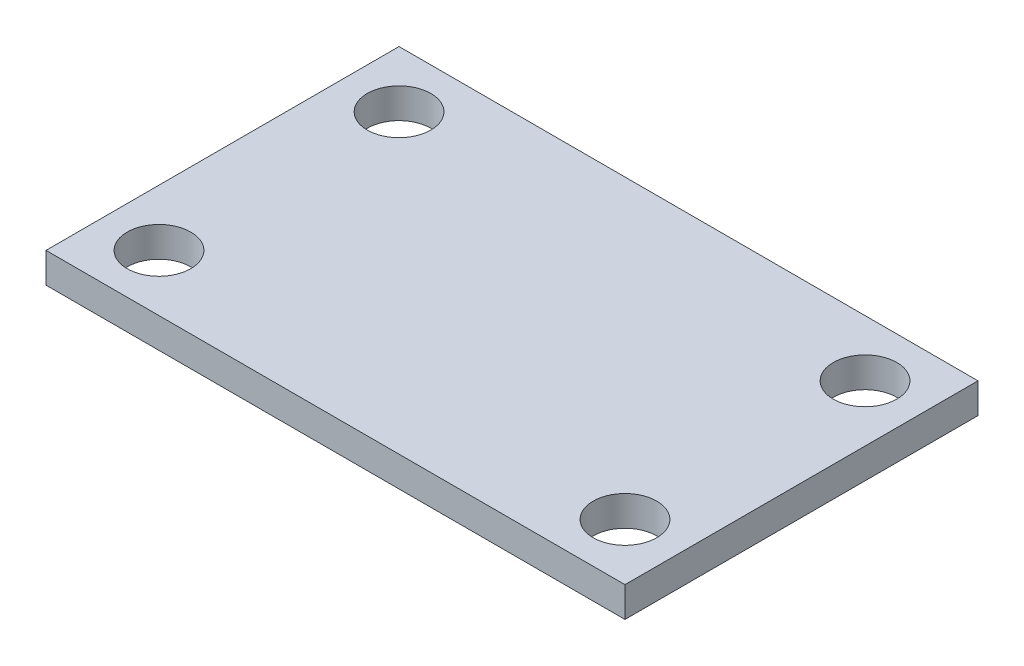
ISO-10303-21;
HEADER;
FILE_DESCRIPTION(('STEP AP214'),'2;1');
FILE_NAME('part.step','',(''),(''),'','','');
FILE_SCHEMA(('AUTOMOTIVE_DESIGN { 1 0 10303 214 1 1 1 1 }'));
ENDSEC;
DATA;
#1=APPLICATION_CONTEXT('core data for automotive mechanical design processes');
#2=APPLICATION_PROTOCOL_DEFINITION('international standard','automotive_design',2000,#1);
#3=PRODUCT_CONTEXT('',#1,'mechanical');
#4=PRODUCT('Part','Part','',(#3));
#5=PRODUCT_RELATED_PRODUCT_CATEGORY('part','',(#4));
#6=PRODUCT_DEFINITION_FORMATION('','',#4);
#7=PRODUCT_DEFINITION_CONTEXT('part definition',#1,'design');
#8=PRODUCT_DEFINITION('design','',#6,#7);
#9=PRODUCT_DEFINITION_SHAPE('','',#8);
#10=(LENGTH_UNIT() NAMED_UNIT(*) SI_UNIT(.MILLI.,.METRE.));
#11=(NAMED_UNIT(*) PLANE_ANGLE_UNIT() SI_UNIT($,.RADIAN.));
#12=(NAMED_UNIT(*) SI_UNIT($,.STERADIAN.) SOLID_ANGLE_UNIT());
#13=UNCERTAINTY_MEASURE_WITH_UNIT(LENGTH_MEASURE(1.E-05),#10,'distance_accuracy_value','');
#14=(GEOMETRIC_REPRESENTATION_CONTEXT(3) GLOBAL_UNCERTAINTY_ASSIGNED_CONTEXT((#13)) GLOBAL_UNIT_ASSIGNED_CONTEXT((#10,
#11,#12)) REPRESENTATION_CONTEXT('',''));
#15=CARTESIAN_POINT('',(0.,0.,0.));
#16=DIRECTION('',(0.,0.,1.));
#17=DIRECTION('',(1.,0.,0.));
#18=AXIS2_PLACEMENT_3D('',#15,#16,#17);
#19=CARTESIAN_POINT('',(-62.6618476114881,-321.310072168843,-531.1739));
#20=DIRECTION('',(0.,1.,0.));
#21=DIRECTION('',(0.,0.,1.));
#22=AXIS2_PLACEMENT_3D('',#19,#20,#21);
#23=PLANE('',#22);
#24=CARTESIAN_POINT('',(-95.6618476114881,-321.310072168843,-548.1739));
#25=DIRECTION('',(0.,-1.,0.));
#26=DIRECTION('',(0.,0.,-1.));
#27=AXIS2_PLACEMENT_3D('',#24,#25,#26);
#28=CIRCLE('',#27,4.5);
#29=CARTESIAN_POINT('',(-95.6618476114881,-321.310072168843,-552.6739));
#30=VERTEX_POINT('',#29);
#31=EDGE_CURVE('E102',#30,#30,#28,.F.);
#32=ORIENTED_EDGE('',*,*,#31,.T.);
#33=EDGE_LOOP('',(#32));
#34=FACE_BOUND('',#33,.T.);
#35=CARTESIAN_POINT('',(-29.6618476114881,-321.310072168843,-548.1739));
#36=DIRECTION('',(0.,-1.,0.));
#37=DIRECTION('',(0.,0.,-1.));
#38=AXIS2_PLACEMENT_3D('',#35,#36,#37);
#39=CIRCLE('',#38,4.5);
#40=CARTESIAN_POINT('',(-29.6618476114881,-321.310072168843,-552.6739));
#41=VERTEX_POINT('',#40);
#42=EDGE_CURVE('E106',#41,#41,#39,.F.);
#43=ORIENTED_EDGE('',*,*,#42,.T.);
#44=EDGE_LOOP('',(#43));
#45=FACE_BOUND('',#44,.T.);
#46=CARTESIAN_POINT('',(-29.6618476114882,-321.310072168843,-514.1739));
#47=DIRECTION('',(0.,-1.,0.));
#48=DIRECTION('',(0.,0.,-1.));
#49=AXIS2_PLACEMENT_3D('',#46,#47,#48);
#50=CIRCLE('',#49,4.5);
#51=CARTESIAN_POINT('',(-29.6618476114882,-321.310072168843,-518.6739));
#52=VERTEX_POINT('',#51);
#53=EDGE_CURVE('E109',#52,#52,#50,.F.);
#54=ORIENTED_EDGE('',*,*,#53,.T.);
#55=EDGE_LOOP('',(#54));
#56=FACE_BOUND('',#55,.T.);
#57=CARTESIAN_POINT('',(-95.6618476114882,-321.310072168843,-514.1739));
#58=DIRECTION('',(0.,-1.,0.));
#59=DIRECTION('',(0.,0.,-1.));
#60=AXIS2_PLACEMENT_3D('',#57,#58,#59);
#61=CIRCLE('',#60,4.5);
#62=CARTESIAN_POINT('',(-95.6618476114882,-321.310072168843,-518.6739));
#63=VERTEX_POINT('',#62);
#64=EDGE_CURVE('E20',#63,#63,#61,.F.);
#65=ORIENTED_EDGE('',*,*,#64,.T.);
#66=EDGE_LOOP('',(#65));
#67=FACE_BOUND('',#66,.T.);
#68=DIRECTION('',(1.,0.,0.));
#69=VECTOR('',#68,1.);
#70=CARTESIAN_POINT('',(-21.6618476114882,-321.310072168843,-506.1739));
#71=LINE('',#70,#69);
#72=CARTESIAN_POINT('',(-103.661847611488,-321.310072168843,-506.1739));
#73=VERTEX_POINT('',#72);
#74=CARTESIAN_POINT('',(-21.6618476114882,-321.310072168843,-506.1739));
#75=VERTEX_POINT('',#74);
#76=EDGE_CURVE('E60',#73,#75,#71,.T.);
#77=ORIENTED_EDGE('',*,*,#76,.F.);
#78=DIRECTION('',(0.,0.,1.));
#79=VECTOR('',#78,1.);
#80=CARTESIAN_POINT('',(-103.661847611488,-321.310072168843,-506.1739));
#81=LINE('',#80,#79);
#82=CARTESIAN_POINT('',(-103.661847611488,-321.310072168843,-556.1739));
#83=VERTEX_POINT('',#82);
#84=EDGE_CURVE('E55',#83,#73,#81,.T.);
#85=ORIENTED_EDGE('',*,*,#84,.F.);
#86=DIRECTION('',(1.,0.,0.));
#87=VECTOR('',#86,1.);
#88=CARTESIAN_POINT('',(-103.661847611488,-321.310072168843,-556.1739));
#89=LINE('',#88,#87);
#90=CARTESIAN_POINT('',(-21.6618476114881,-321.310072168843,-556.1739));
#91=VERTEX_POINT('',#90);
#92=EDGE_CURVE('E73',#91,#83,#89,.F.);
#93=ORIENTED_EDGE('',*,*,#92,.F.);
#94=DIRECTION('',(0.,0.,-1.));
#95=VECTOR('',#94,1.);
#96=CARTESIAN_POINT('',(-21.6618476114881,-321.310072168843,-556.1739));
#97=LINE('',#96,#95);
#98=EDGE_CURVE('E70',#75,#91,#97,.T.);
#99=ORIENTED_EDGE('',*,*,#98,.F.);
#100=EDGE_LOOP('',(#77,#85,#93,#99));
#101=FACE_BOUND('',#100,.T.);
#102=ADVANCED_FACE('F17',(#34,#45,#56,#67,#101),#23,.F.);
#103=CARTESIAN_POINT('',(-21.6618476114881,-321.310072168843,-556.1739));
#104=DIRECTION('',(1.,0.,0.));
#105=DIRECTION('',(0.,0.,-1.));
#106=AXIS2_PLACEMENT_3D('',#103,#104,#105);
#107=PLANE('',#106);
#108=DIRECTION('',(0.,0.,-1.));
#109=VECTOR('',#108,1.);
#110=CARTESIAN_POINT('',(-21.6618476114881,-317.039072168843,-382.8876));
#111=LINE('',#110,#109);
#112=CARTESIAN_POINT('',(-21.6618476114881,-317.039072168843,-556.1739));
#113=VERTEX_POINT('',#112);
#114=CARTESIAN_POINT('',(-21.6618476114881,-317.039072168843,-506.1739));
#115=VERTEX_POINT('',#114);
#116=EDGE_CURVE('E81',#113,#115,#111,.F.);
#117=ORIENTED_EDGE('',*,*,#116,.T.);
#118=DIRECTION('',(0.,-1.,0.));
#119=VECTOR('',#118,1.);
#120=CARTESIAN_POINT('',(-21.6618476114882,-321.310072168843,-506.1739));
#121=LINE('',#120,#119);
#122=EDGE_CURVE('E65',#75,#115,#121,.F.);
#123=ORIENTED_EDGE('',*,*,#122,.F.);
#124=ORIENTED_EDGE('',*,*,#98,.T.);
#125=DIRECTION('',(0.,1.,0.));
#126=VECTOR('',#125,1.);
#127=CARTESIAN_POINT('',(-21.6618476114881,-321.310072168843,-556.1739));
#128=LINE('',#127,#126);
#129=EDGE_CURVE('E116',#113,#91,#128,.F.);
#130=ORIENTED_EDGE('',*,*,#129,.F.);
#131=EDGE_LOOP('',(#117,#123,#124,#130));
#132=FACE_BOUND('',#131,.T.);
#133=ADVANCED_FACE('F80',(#132),#107,.T.);
#134=CARTESIAN_POINT('',(-21.6618476114882,-321.310072168843,-506.1739));
#135=DIRECTION('',(0.,0.,1.));
#136=DIRECTION('',(0.,-1.,0.));
#137=AXIS2_PLACEMENT_3D('',#134,#135,#136);
#138=PLANE('',#137);
#139=DIRECTION('',(1.,0.,0.));
#140=VECTOR('',#139,1.);
#141=CARTESIAN_POINT('',(-142.584347611488,-317.039072168843,-506.1739));
#142=LINE('',#141,#140);
#143=CARTESIAN_POINT('',(-103.661847611488,-317.039072168843,-506.1739));
#144=VERTEX_POINT('',#143);
#145=EDGE_CURVE('E134',#115,#144,#142,.F.);
#146=ORIENTED_EDGE('',*,*,#145,.T.);
#147=DIRECTION('',(0.,1.,0.));
#148=VECTOR('',#147,1.);
#149=CARTESIAN_POINT('',(-103.661847611488,-321.310072168843,-506.1739));
#150=LINE('',#149,#148);
#151=EDGE_CURVE('E67',#73,#144,#150,.T.);
#152=ORIENTED_EDGE('',*,*,#151,.F.);
#153=ORIENTED_EDGE('',*,*,#76,.T.);
#154=ORIENTED_EDGE('',*,*,#122,.T.);
#155=EDGE_LOOP('',(#146,#152,#153,#154));
#156=FACE_BOUND('',#155,.T.);
#157=ADVANCED_FACE('F63',(#156),#138,.T.);
#158=CARTESIAN_POINT('',(-103.661847611488,-321.310072168843,-506.1739));
#159=DIRECTION('',(-1.,0.,0.));
#160=DIRECTION('',(0.,0.,1.));
#161=AXIS2_PLACEMENT_3D('',#158,#159,#160);
#162=PLANE('',#161);
#163=DIRECTION('',(0.,0.,-1.));
#164=VECTOR('',#163,1.);
#165=CARTESIAN_POINT('',(-103.661847611488,-317.039072168843,-382.8876));
#166=LINE('',#165,#164);
#167=CARTESIAN_POINT('',(-103.661847611488,-317.039072168843,-556.1739));
#168=VERTEX_POINT('',#167);
#169=EDGE_CURVE('E131',#144,#168,#166,.T.);
#170=ORIENTED_EDGE('',*,*,#169,.T.);
#171=DIRECTION('',(0.,1.,0.));
#172=VECTOR('',#171,1.);
#173=CARTESIAN_POINT('',(-103.661847611488,-321.310072168843,-556.1739));
#174=LINE('',#173,#172);
#175=EDGE_CURVE('E36',#83,#168,#174,.T.);
#176=ORIENTED_EDGE('',*,*,#175,.F.);
#177=ORIENTED_EDGE('',*,*,#84,.T.);
#178=ORIENTED_EDGE('',*,*,#151,.T.);
#179=EDGE_LOOP('',(#170,#176,#177,#178));
#180=FACE_BOUND('',#179,.T.);
#181=ADVANCED_FACE('F130',(#180),#162,.T.);
#182=CARTESIAN_POINT('',(-103.661847611488,-321.310072168843,-556.1739));
#183=DIRECTION('',(0.,0.,-1.));
#184=DIRECTION('',(0.,1.,0.));
#185=AXIS2_PLACEMENT_3D('',#182,#183,#184);
#186=PLANE('',#185);
#187=DIRECTION('',(1.,0.,0.));
#188=VECTOR('',#187,1.);
#189=CARTESIAN_POINT('',(-142.584347611488,-317.039072168843,-556.1739));
#190=LINE('',#189,#188);
#191=EDGE_CURVE('E101',#168,#113,#190,.T.);
#192=ORIENTED_EDGE('',*,*,#191,.T.);
#193=ORIENTED_EDGE('',*,*,#129,.T.);
#194=ORIENTED_EDGE('',*,*,#92,.T.);
#195=ORIENTED_EDGE('',*,*,#175,.T.);
#196=EDGE_LOOP('',(#192,#193,#194,#195));
#197=FACE_BOUND('',#196,.T.);
#198=ADVANCED_FACE('F140',(#197),#186,.T.);
#199=CARTESIAN_POINT('',(-95.6618476114882,-321.310072168843,-514.1739));
#200=DIRECTION('',(0.,-1.,0.));
#201=DIRECTION('',(0.,0.,-1.));
#202=AXIS2_PLACEMENT_3D('',#199,#200,#201);
#203=CYLINDRICAL_SURFACE('',#202,4.5);
#204=ORIENTED_EDGE('',*,*,#64,.F.);
#205=EDGE_LOOP('',(#204));
#206=FACE_BOUND('',#205,.T.);
#207=CARTESIAN_POINT('',(-95.6618476114882,-317.039072168843,-514.1739));
#208=DIRECTION('',(0.,-1.,0.));
#209=DIRECTION('',(0.,0.,-1.));
#210=AXIS2_PLACEMENT_3D('',#207,#208,#209);
#211=CIRCLE('',#210,4.5);
#212=CARTESIAN_POINT('',(-95.6618476114882,-317.039072168843,-518.6739));
#213=VERTEX_POINT('',#212);
#214=EDGE_CURVE('E98',#213,#213,#211,.F.);
#215=ORIENTED_EDGE('',*,*,#214,.T.);
#216=EDGE_LOOP('',(#215));
#217=FACE_BOUND('',#216,.T.);
#218=ADVANCED_FACE('F142',(#206,#217),#203,.F.);
#219=CARTESIAN_POINT('',(-29.6618476114882,-321.310072168843,-514.1739));
#220=DIRECTION('',(0.,-1.,0.));
#221=DIRECTION('',(0.,0.,-1.));
#222=AXIS2_PLACEMENT_3D('',#219,#220,#221);
#223=CYLINDRICAL_SURFACE('',#222,4.5);
#224=ORIENTED_EDGE('',*,*,#53,.F.);
#225=EDGE_LOOP('',(#224));
#226=FACE_BOUND('',#225,.T.);
#227=CARTESIAN_POINT('',(-29.6618476114882,-317.039072168843,-514.1739));
#228=DIRECTION('',(0.,-1.,0.));
#229=DIRECTION('',(0.,0.,-1.));
#230=AXIS2_PLACEMENT_3D('',#227,#228,#229);
#231=CIRCLE('',#230,4.5);
#232=CARTESIAN_POINT('',(-29.6618476114882,-317.039072168843,-518.6739));
#233=VERTEX_POINT('',#232);
#234=EDGE_CURVE('E94',#233,#233,#231,.F.);
#235=ORIENTED_EDGE('',*,*,#234,.T.);
#236=EDGE_LOOP('',(#235));
#237=FACE_BOUND('',#236,.T.);
#238=ADVANCED_FACE('F148',(#226,#237),#223,.F.);
#239=CARTESIAN_POINT('',(-29.6618476114881,-321.310072168843,-548.1739));
#240=DIRECTION('',(0.,-1.,0.));
#241=DIRECTION('',(0.,0.,-1.));
#242=AXIS2_PLACEMENT_3D('',#239,#240,#241);
#243=CYLINDRICAL_SURFACE('',#242,4.5);
#244=ORIENTED_EDGE('',*,*,#42,.F.);
#245=EDGE_LOOP('',(#244));
#246=FACE_BOUND('',#245,.T.);
#247=CARTESIAN_POINT('',(-29.6618476114881,-317.039072168843,-548.1739));
#248=DIRECTION('',(0.,-1.,0.));
#249=DIRECTION('',(0.,0.,-1.));
#250=AXIS2_PLACEMENT_3D('',#247,#248,#249);
#251=CIRCLE('',#250,4.5);
#252=CARTESIAN_POINT('',(-29.6618476114881,-317.039072168843,-552.6739));
#253=VERTEX_POINT('',#252);
#254=EDGE_CURVE('E27',#253,#253,#251,.F.);
#255=ORIENTED_EDGE('',*,*,#254,.T.);
#256=EDGE_LOOP('',(#255));
#257=FACE_BOUND('',#256,.T.);
#258=ADVANCED_FACE('F158',(#246,#257),#243,.F.);
#259=CARTESIAN_POINT('',(-95.6618476114881,-321.310072168843,-548.1739));
#260=DIRECTION('',(0.,-1.,0.));
#261=DIRECTION('',(0.,0.,-1.));
#262=AXIS2_PLACEMENT_3D('',#259,#260,#261);
#263=CYLINDRICAL_SURFACE('',#262,4.5);
#264=ORIENTED_EDGE('',*,*,#31,.F.);
#265=EDGE_LOOP('',(#264));
#266=FACE_BOUND('',#265,.T.);
#267=CARTESIAN_POINT('',(-95.6618476114881,-317.039072168843,-548.1739));
#268=DIRECTION('',(0.,-1.,0.));
#269=DIRECTION('',(0.,0.,-1.));
#270=AXIS2_PLACEMENT_3D('',#267,#268,#269);
#271=CIRCLE('',#270,4.5);
#272=CARTESIAN_POINT('',(-95.6618476114881,-317.039072168843,-552.6739));
#273=VERTEX_POINT('',#272);
#274=EDGE_CURVE('E11',#273,#273,#271,.F.);
#275=ORIENTED_EDGE('',*,*,#274,.T.);
#276=EDGE_LOOP('',(#275));
#277=FACE_BOUND('',#276,.T.);
#278=ADVANCED_FACE('F153',(#266,#277),#263,.F.);
#279=CARTESIAN_POINT('',(-142.584347611488,-317.039072168843,-382.8876));
#280=DIRECTION('',(0.,-1.,0.));
#281=DIRECTION('',(0.,0.,-1.));
#282=AXIS2_PLACEMENT_3D('',#279,#280,#281);
#283=PLANE('',#282);
#284=ORIENTED_EDGE('',*,*,#274,.F.);
#285=EDGE_LOOP('',(#284));
#286=FACE_BOUND('',#285,.T.);
#287=ORIENTED_EDGE('',*,*,#254,.F.);
#288=EDGE_LOOP('',(#287));
#289=FACE_BOUND('',#288,.T.);
#290=ORIENTED_EDGE('',*,*,#234,.F.);
#291=EDGE_LOOP('',(#290));
#292=FACE_BOUND('',#291,.T.);
#293=ORIENTED_EDGE('',*,*,#214,.F.);
#294=EDGE_LOOP('',(#293));
#295=FACE_BOUND('',#294,.T.);
#296=ORIENTED_EDGE('',*,*,#169,.F.);
#297=ORIENTED_EDGE('',*,*,#145,.F.);
#298=ORIENTED_EDGE('',*,*,#116,.F.);
#299=ORIENTED_EDGE('',*,*,#191,.F.);
#300=EDGE_LOOP('',(#296,#297,#298,#299));
#301=FACE_BOUND('',#300,.T.);
#302=ADVANCED_FACE('F133',(#286,#289,#292,#295,#301),#283,.F.);
#303=CLOSED_SHELL('',(#102,#133,#157,#181,#198,#218,#238,#258,#278,#302));
#304=MANIFOLD_SOLID_BREP('B1',#303);
#305=ADVANCED_BREP_SHAPE_REPRESENTATION('',(#18,#304),#14);
#306=SHAPE_DEFINITION_REPRESENTATION(#9,#305);
ENDSEC;
END-ISO-10303-21;
